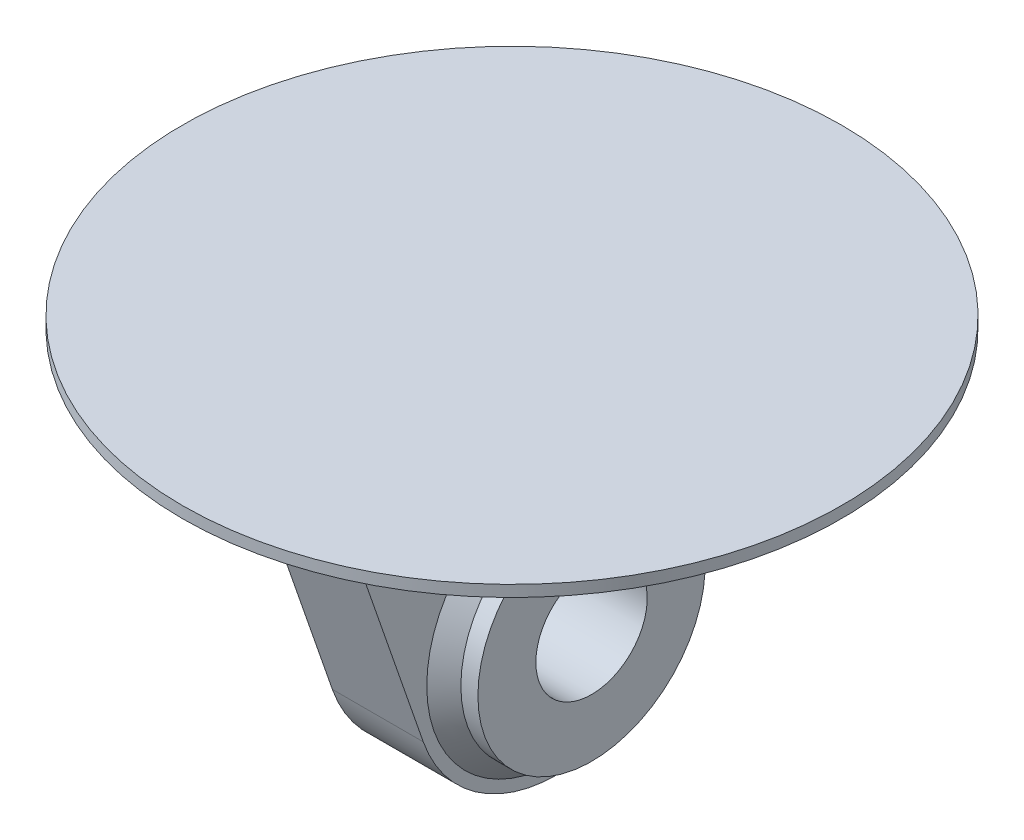
ISO-10303-21;
HEADER;
FILE_DESCRIPTION(('STEP AP214'),'2;1');
FILE_NAME('part.step','',(''),(''),'','','');
FILE_SCHEMA(('AUTOMOTIVE_DESIGN { 1 0 10303 214 1 1 1 1 }'));
ENDSEC;
DATA;
#1=APPLICATION_CONTEXT('core data for automotive mechanical design processes');
#2=APPLICATION_PROTOCOL_DEFINITION('international standard','automotive_design',2000,#1);
#3=PRODUCT_CONTEXT('',#1,'mechanical');
#4=PRODUCT('Part','Part','',(#3));
#5=PRODUCT_RELATED_PRODUCT_CATEGORY('part','',(#4));
#6=PRODUCT_DEFINITION_FORMATION('','',#4);
#7=PRODUCT_DEFINITION_CONTEXT('part definition',#1,'design');
#8=PRODUCT_DEFINITION('design','',#6,#7);
#9=PRODUCT_DEFINITION_SHAPE('','',#8);
#10=(LENGTH_UNIT() NAMED_UNIT(*) SI_UNIT(.MILLI.,.METRE.));
#11=(NAMED_UNIT(*) PLANE_ANGLE_UNIT() SI_UNIT($,.RADIAN.));
#12=(NAMED_UNIT(*) SI_UNIT($,.STERADIAN.) SOLID_ANGLE_UNIT());
#13=UNCERTAINTY_MEASURE_WITH_UNIT(LENGTH_MEASURE(1.E-05),#10,'distance_accuracy_value','');
#14=(GEOMETRIC_REPRESENTATION_CONTEXT(3) GLOBAL_UNCERTAINTY_ASSIGNED_CONTEXT((#13)) GLOBAL_UNIT_ASSIGNED_CONTEXT((#10,
#11,#12)) REPRESENTATION_CONTEXT('',''));
#15=CARTESIAN_POINT('',(0.,0.,0.));
#16=DIRECTION('',(0.,0.,1.));
#17=DIRECTION('',(1.,0.,0.));
#18=AXIS2_PLACEMENT_3D('',#15,#16,#17);
#19=CARTESIAN_POINT('',(0.,0.,0.));
#20=DIRECTION('',(0.,-1.,0.));
#21=DIRECTION('',(0.,0.,-1.));
#22=AXIS2_PLACEMENT_3D('',#19,#20,#21);
#23=PLANE('',#22);
#24=CARTESIAN_POINT('',(0.,0.,0.));
#25=DIRECTION('',(0.,1.,0.));
#26=DIRECTION('',(0.,0.,1.));
#27=AXIS2_PLACEMENT_3D('',#24,#25,#26);
#28=CIRCLE('',#27,368.3);
#29=CARTESIAN_POINT('',(0.,0.,368.3));
#30=VERTEX_POINT('',#29);
#31=EDGE_CURVE('E11',#30,#30,#28,.T.);
#32=ORIENTED_EDGE('',*,*,#31,.T.);
#33=EDGE_LOOP('',(#32));
#34=FACE_BOUND('',#33,.T.);
#35=ADVANCED_FACE('F17',(#34),#23,.F.);
#36=CARTESIAN_POINT('',(1828.8,-260.35,2.80128558521545E-13));
#37=DIRECTION('',(-1.,0.,0.));
#38=DIRECTION('',(0.,0.,1.));
#39=AXIS2_PLACEMENT_3D('',#36,#37,#38);
#40=CYLINDRICAL_SURFACE('',#39,62.23);
#41=CARTESIAN_POINT('',(-88.9,-260.35,0.));
#42=DIRECTION('',(-1.,0.,0.));
#43=DIRECTION('',(0.,0.,1.));
#44=AXIS2_PLACEMENT_3D('',#41,#42,#43);
#45=CIRCLE('',#44,62.23);
#46=CARTESIAN_POINT('',(-88.9,-260.35,62.23));
#47=VERTEX_POINT('',#46);
#48=EDGE_CURVE('E290',#47,#47,#45,.T.);
#49=ORIENTED_EDGE('',*,*,#48,.T.);
#50=EDGE_LOOP('',(#49));
#51=FACE_BOUND('',#50,.T.);
#52=CARTESIAN_POINT('',(88.9,-260.35,0.));
#53=DIRECTION('',(-1.,0.,0.));
#54=DIRECTION('',(0.,0.,1.));
#55=AXIS2_PLACEMENT_3D('',#52,#53,#54);
#56=CIRCLE('',#55,62.23);
#57=CARTESIAN_POINT('',(88.9,-260.35,62.23));
#58=VERTEX_POINT('',#57);
#59=EDGE_CURVE('E284',#58,#58,#56,.T.);
#60=ORIENTED_EDGE('',*,*,#59,.F.);
#61=EDGE_LOOP('',(#60));
#62=FACE_BOUND('',#61,.T.);
#63=ADVANCED_FACE('F460',(#51,#62),#40,.F.);
#64=CARTESIAN_POINT('',(88.9,-260.35,0.));
#65=DIRECTION('',(-1.,0.,0.));
#66=DIRECTION('',(0.,0.,1.));
#67=AXIS2_PLACEMENT_3D('',#64,#65,#66);
#68=PLANE('',#67);
#69=ORIENTED_EDGE('',*,*,#59,.T.);
#70=EDGE_LOOP('',(#69));
#71=FACE_BOUND('',#70,.T.);
#72=CARTESIAN_POINT('',(88.9,-260.35,0.));
#73=DIRECTION('',(-1.,0.,0.));
#74=DIRECTION('',(0.,0.,1.));
#75=AXIS2_PLACEMENT_3D('',#72,#73,#74);
#76=CIRCLE('',#75,127.);
#77=CARTESIAN_POINT('',(88.9,-260.35,127.));
#78=VERTEX_POINT('',#77);
#79=EDGE_CURVE('E280',#78,#78,#76,.T.);
#80=ORIENTED_EDGE('',*,*,#79,.F.);
#81=EDGE_LOOP('',(#80));
#82=FACE_BOUND('',#81,.T.);
#83=ADVANCED_FACE('F467',(#71,#82),#68,.F.);
#84=CARTESIAN_POINT('',(-88.9,-260.35,0.));
#85=DIRECTION('',(-1.,0.,0.));
#86=DIRECTION('',(0.,0.,1.));
#87=AXIS2_PLACEMENT_3D('',#84,#85,#86);
#88=PLANE('',#87);
#89=CARTESIAN_POINT('',(-88.9,-260.35,0.));
#90=DIRECTION('',(-1.,0.,0.));
#91=DIRECTION('',(0.,0.,1.));
#92=AXIS2_PLACEMENT_3D('',#89,#90,#91);
#93=CIRCLE('',#92,127.);
#94=CARTESIAN_POINT('',(-88.9,-260.35,127.));
#95=VERTEX_POINT('',#94);
#96=EDGE_CURVE('E287',#95,#95,#93,.T.);
#97=ORIENTED_EDGE('',*,*,#96,.T.);
#98=EDGE_LOOP('',(#97));
#99=FACE_BOUND('',#98,.T.);
#100=ORIENTED_EDGE('',*,*,#48,.F.);
#101=EDGE_LOOP('',(#100));
#102=FACE_BOUND('',#101,.T.);
#103=ADVANCED_FACE('F503',(#99,#102),#88,.T.);
#104=CARTESIAN_POINT('',(88.9,-260.35,0.));
#105=DIRECTION('',(-1.,0.,0.));
#106=DIRECTION('',(0.,0.,1.));
#107=AXIS2_PLACEMENT_3D('',#104,#105,#106);
#108=CYLINDRICAL_SURFACE('',#107,127.);
#109=CARTESIAN_POINT('',(69.85,-260.35,0.));
#110=DIRECTION('',(-1.,0.,0.));
#111=DIRECTION('',(0.,0.,1.));
#112=AXIS2_PLACEMENT_3D('',#109,#110,#111);
#113=CIRCLE('',#112,127.);
#114=CARTESIAN_POINT('',(69.85,-260.35,127.));
#115=VERTEX_POINT('',#114);
#116=EDGE_CURVE('E231',#115,#115,#113,.F.);
#117=ORIENTED_EDGE('',*,*,#116,.T.);
#118=EDGE_LOOP('',(#117));
#119=FACE_BOUND('',#118,.T.);
#120=ORIENTED_EDGE('',*,*,#79,.T.);
#121=EDGE_LOOP('',(#120));
#122=FACE_BOUND('',#121,.T.);
#123=ADVANCED_FACE('F499',(#119,#122),#108,.T.);
#124=CARTESIAN_POINT('',(-69.85,-260.35,0.));
#125=DIRECTION('',(1.,0.,0.));
#126=DIRECTION('',(0.,0.,-1.));
#127=AXIS2_PLACEMENT_3D('',#124,#125,#126);
#128=CIRCLE('',#127,127.);
#129=CARTESIAN_POINT('',(-69.85,-260.35,-127.));
#130=VERTEX_POINT('',#129);
#131=EDGE_CURVE('E237',#130,#130,#128,.F.);
#132=ORIENTED_EDGE('',*,*,#131,.T.);
#133=EDGE_LOOP('',(#132));
#134=FACE_BOUND('',#133,.T.);
#135=ORIENTED_EDGE('',*,*,#96,.F.);
#136=EDGE_LOOP('',(#135));
#137=FACE_BOUND('',#136,.T.);
#138=ADVANCED_FACE('F502',(#134,#137),#108,.T.);
#139=CARTESIAN_POINT('',(-69.85,-88.9,0.));
#140=DIRECTION('',(0.707106781186549,0.707106781186546,0.));
#141=DIRECTION('',(0.,0.,-1.));
#142=AXIS2_PLACEMENT_3D('',#139,#140,#141);
#143=PLANE('',#142);
#144=DIRECTION('',(-0.707106781186546,0.707106781186549,0.));
#145=VECTOR('',#144,1.);
#146=CARTESIAN_POINT('',(-69.85,-88.9,-101.6));
#147=LINE('',#146,#145);
#148=CARTESIAN_POINT('',(-127.,-31.75,-101.6));
#149=VERTEX_POINT('',#148);
#150=CARTESIAN_POINT('',(-69.85,-88.9,-101.6));
#151=VERTEX_POINT('',#150);
#152=EDGE_CURVE('E204',#149,#151,#147,.F.);
#153=ORIENTED_EDGE('',*,*,#152,.F.);
#154=DIRECTION('',(0.,0.,1.));
#155=VECTOR('',#154,1.);
#156=CARTESIAN_POINT('',(-127.,-31.75,-101.6));
#157=LINE('',#156,#155);
#158=CARTESIAN_POINT('',(-127.,-31.75,-139.7));
#159=VERTEX_POINT('',#158);
#160=EDGE_CURVE('E206',#159,#149,#157,.T.);
#161=ORIENTED_EDGE('',*,*,#160,.F.);
#162=DIRECTION('',(0.707106781186546,-0.707106781186549,0.));
#163=VECTOR('',#162,1.);
#164=CARTESIAN_POINT('',(-69.85,-88.9,-139.7));
#165=LINE('',#164,#163);
#166=CARTESIAN_POINT('',(-69.85,-88.9,-139.7));
#167=VERTEX_POINT('',#166);
#168=EDGE_CURVE('E208',#167,#159,#165,.F.);
#169=ORIENTED_EDGE('',*,*,#168,.F.);
#170=DIRECTION('',(0.,0.,-1.));
#171=VECTOR('',#170,1.);
#172=CARTESIAN_POINT('',(-69.85,-88.9,0.));
#173=LINE('',#172,#171);
#174=EDGE_CURVE('E210',#151,#167,#173,.T.);
#175=ORIENTED_EDGE('',*,*,#174,.F.);
#176=EDGE_LOOP('',(#153,#161,#169,#175));
#177=FACE_BOUND('',#176,.T.);
#178=ADVANCED_FACE('F733',(#177),#143,.F.);
#179=CARTESIAN_POINT('',(69.85,-88.9,0.));
#180=DIRECTION('',(0.707106781186549,-0.707106781186546,0.));
#181=DIRECTION('',(0.,0.,-1.));
#182=AXIS2_PLACEMENT_3D('',#179,#180,#181);
#183=PLANE('',#182);
#184=DIRECTION('',(-0.707106781186546,-0.707106781186549,0.));
#185=VECTOR('',#184,1.);
#186=CARTESIAN_POINT('',(69.85,-88.9,-139.7));
#187=LINE('',#186,#185);
#188=CARTESIAN_POINT('',(127.,-31.75,-139.7));
#189=VERTEX_POINT('',#188);
#190=CARTESIAN_POINT('',(69.85,-88.9,-139.7));
#191=VERTEX_POINT('',#190);
#192=EDGE_CURVE('E213',#189,#191,#187,.T.);
#193=ORIENTED_EDGE('',*,*,#192,.F.);
#194=DIRECTION('',(0.,0.,-1.));
#195=VECTOR('',#194,1.);
#196=CARTESIAN_POINT('',(127.,-31.75,-139.7));
#197=LINE('',#196,#195);
#198=CARTESIAN_POINT('',(127.,-31.75,-101.6));
#199=VERTEX_POINT('',#198);
#200=EDGE_CURVE('E215',#199,#189,#197,.T.);
#201=ORIENTED_EDGE('',*,*,#200,.F.);
#202=DIRECTION('',(0.707106781186546,0.707106781186549,0.));
#203=VECTOR('',#202,1.);
#204=CARTESIAN_POINT('',(69.85,-88.9,-101.6));
#205=LINE('',#204,#203);
#206=CARTESIAN_POINT('',(69.85,-88.9,-101.6));
#207=VERTEX_POINT('',#206);
#208=EDGE_CURVE('E217',#207,#199,#205,.T.);
#209=ORIENTED_EDGE('',*,*,#208,.F.);
#210=DIRECTION('',(0.,0.,1.));
#211=VECTOR('',#210,1.);
#212=CARTESIAN_POINT('',(69.85,-88.9,-101.6));
#213=LINE('',#212,#211);
#214=EDGE_CURVE('E219',#191,#207,#213,.T.);
#215=ORIENTED_EDGE('',*,*,#214,.F.);
#216=EDGE_LOOP('',(#193,#201,#209,#215));
#217=FACE_BOUND('',#216,.T.);
#218=ADVANCED_FACE('F724',(#217),#183,.T.);
#219=CARTESIAN_POINT('',(69.85,-88.9,0.));
#220=DIRECTION('',(0.707106781186549,-0.707106781186546,0.));
#221=DIRECTION('',(0.,0.,-1.));
#222=AXIS2_PLACEMENT_3D('',#219,#220,#221);
#223=PLANE('',#222);
#224=DIRECTION('',(-0.707106781186546,-0.707106781186549,0.));
#225=VECTOR('',#224,1.);
#226=CARTESIAN_POINT('',(69.85,-88.9,101.6));
#227=LINE('',#226,#225);
#228=CARTESIAN_POINT('',(127.,-31.75,101.6));
#229=VERTEX_POINT('',#228);
#230=CARTESIAN_POINT('',(69.85,-88.9,101.6));
#231=VERTEX_POINT('',#230);
#232=EDGE_CURVE('E222',#229,#231,#227,.T.);
#233=ORIENTED_EDGE('',*,*,#232,.F.);
#234=DIRECTION('',(0.,0.,-1.));
#235=VECTOR('',#234,1.);
#236=CARTESIAN_POINT('',(127.,-31.75,101.6));
#237=LINE('',#236,#235);
#238=CARTESIAN_POINT('',(127.,-31.75,139.7));
#239=VERTEX_POINT('',#238);
#240=EDGE_CURVE('E224',#239,#229,#237,.T.);
#241=ORIENTED_EDGE('',*,*,#240,.F.);
#242=DIRECTION('',(0.707106781186546,0.707106781186549,0.));
#243=VECTOR('',#242,1.);
#244=CARTESIAN_POINT('',(69.85,-88.9,139.7));
#245=LINE('',#244,#243);
#246=CARTESIAN_POINT('',(69.85,-88.9,139.7));
#247=VERTEX_POINT('',#246);
#248=EDGE_CURVE('E226',#247,#239,#245,.T.);
#249=ORIENTED_EDGE('',*,*,#248,.F.);
#250=DIRECTION('',(0.,0.,1.));
#251=VECTOR('',#250,1.);
#252=CARTESIAN_POINT('',(69.85,-88.9,139.7));
#253=LINE('',#252,#251);
#254=EDGE_CURVE('E228',#231,#247,#253,.T.);
#255=ORIENTED_EDGE('',*,*,#254,.F.);
#256=EDGE_LOOP('',(#233,#241,#249,#255));
#257=FACE_BOUND('',#256,.T.);
#258=ADVANCED_FACE('F441',(#257),#223,.T.);
#259=CARTESIAN_POINT('',(0.,-88.9,0.));
#260=DIRECTION('',(0.,-1.,0.));
#261=DIRECTION('',(0.,0.,-1.));
#262=AXIS2_PLACEMENT_3D('',#259,#260,#261);
#263=PLANE('',#262);
#264=DIRECTION('',(1.,0.,0.));
#265=VECTOR('',#264,1.);
#266=CARTESIAN_POINT('',(50.8,-88.9,101.6));
#267=LINE('',#266,#265);
#268=CARTESIAN_POINT('',(50.8,-88.9,101.6));
#269=VERTEX_POINT('',#268);
#270=EDGE_CURVE('E315',#269,#231,#267,.T.);
#271=ORIENTED_EDGE('',*,*,#270,.T.);
#272=ORIENTED_EDGE('',*,*,#254,.T.);
#273=DIRECTION('',(-1.,0.,0.));
#274=VECTOR('',#273,1.);
#275=CARTESIAN_POINT('',(50.8,-88.9,139.7));
#276=LINE('',#275,#274);
#277=CARTESIAN_POINT('',(50.8,-88.9,139.7));
#278=VERTEX_POINT('',#277);
#279=EDGE_CURVE('E303',#247,#278,#276,.T.);
#280=ORIENTED_EDGE('',*,*,#279,.T.);
#281=DIRECTION('',(0.,0.,-1.));
#282=VECTOR('',#281,1.);
#283=CARTESIAN_POINT('',(50.8,-88.9,139.7));
#284=LINE('',#283,#282);
#285=EDGE_CURVE('E307',#278,#269,#284,.T.);
#286=ORIENTED_EDGE('',*,*,#285,.T.);
#287=EDGE_LOOP('',(#271,#272,#280,#286));
#288=FACE_BOUND('',#287,.T.);
#289=ADVANCED_FACE('F444',(#288),#263,.T.);
#290=CARTESIAN_POINT('',(0.,-88.9,0.));
#291=DIRECTION('',(0.,-1.,0.));
#292=DIRECTION('',(0.,0.,-1.));
#293=AXIS2_PLACEMENT_3D('',#290,#291,#292);
#294=PLANE('',#293);
#295=DIRECTION('',(1.,0.,0.));
#296=VECTOR('',#295,1.);
#297=CARTESIAN_POINT('',(50.8,-88.9,-139.7));
#298=LINE('',#297,#296);
#299=CARTESIAN_POINT('',(50.8,-88.9,-139.7));
#300=VERTEX_POINT('',#299);
#301=EDGE_CURVE('E323',#300,#191,#298,.T.);
#302=ORIENTED_EDGE('',*,*,#301,.T.);
#303=ORIENTED_EDGE('',*,*,#214,.T.);
#304=DIRECTION('',(-1.,0.,0.));
#305=VECTOR('',#304,1.);
#306=CARTESIAN_POINT('',(50.8,-88.9,-101.6));
#307=LINE('',#306,#305);
#308=CARTESIAN_POINT('',(50.8,-88.9,-101.6));
#309=VERTEX_POINT('',#308);
#310=EDGE_CURVE('E327',#207,#309,#307,.T.);
#311=ORIENTED_EDGE('',*,*,#310,.T.);
#312=DIRECTION('',(0.,0.,-1.));
#313=VECTOR('',#312,1.);
#314=CARTESIAN_POINT('',(50.8,-88.9,-101.6));
#315=LINE('',#314,#313);
#316=EDGE_CURVE('E320',#309,#300,#315,.T.);
#317=ORIENTED_EDGE('',*,*,#316,.T.);
#318=EDGE_LOOP('',(#302,#303,#311,#317));
#319=FACE_BOUND('',#318,.T.);
#320=ADVANCED_FACE('F528',(#319),#294,.T.);
#321=CARTESIAN_POINT('',(50.8,-260.35,0.));
#322=DIRECTION('',(-1.,0.,0.));
#323=DIRECTION('',(0.,0.,1.));
#324=AXIS2_PLACEMENT_3D('',#321,#322,#323);
#325=CONICAL_SURFACE('',#324,146.05,0.785398163397454);
#326=ORIENTED_EDGE('',*,*,#116,.F.);
#327=EDGE_LOOP('',(#326));
#328=FACE_BOUND('',#327,.T.);
#329=CARTESIAN_POINT('',(50.8,-260.35,0.));
#330=DIRECTION('',(-1.,0.,0.));
#331=DIRECTION('',(0.,0.,1.));
#332=AXIS2_PLACEMENT_3D('',#329,#330,#331);
#333=CIRCLE('',#332,146.05);
#334=CARTESIAN_POINT('',(50.8,-260.35,146.05));
#335=VERTEX_POINT('',#334);
#336=EDGE_CURVE('E234',#335,#335,#333,.T.);
#337=ORIENTED_EDGE('',*,*,#336,.F.);
#338=EDGE_LOOP('',(#337));
#339=FACE_BOUND('',#338,.T.);
#340=ADVANCED_FACE('F496',(#328,#339),#325,.T.);
#341=CARTESIAN_POINT('',(1828.8,-260.35,2.80128558521545E-13));
#342=DIRECTION('',(-1.,0.,0.));
#343=DIRECTION('',(0.,0.,1.));
#344=AXIS2_PLACEMENT_3D('',#341,#342,#343);
#345=CYLINDRICAL_SURFACE('',#344,158.75);
#346=DIRECTION('',(-1.,0.,0.));
#347=VECTOR('',#346,1.);
#348=CARTESIAN_POINT('',(1828.8,-312.405318269349,149.972685312616));
#349=LINE('',#348,#347);
#350=CARTESIAN_POINT('',(50.8,-312.405318269349,149.972685312615));
#351=VERTEX_POINT('',#350);
#352=CARTESIAN_POINT('',(-50.8,-312.405318269349,149.972685312615));
#353=VERTEX_POINT('',#352);
#354=EDGE_CURVE('E277',#351,#353,#349,.T.);
#355=ORIENTED_EDGE('',*,*,#354,.T.);
#356=CARTESIAN_POINT('',(-50.8,-260.35,0.));
#357=DIRECTION('',(1.,0.,0.));
#358=DIRECTION('',(0.,0.,1.));
#359=AXIS2_PLACEMENT_3D('',#356,#357,#358);
#360=CIRCLE('',#359,158.75);
#361=CARTESIAN_POINT('',(-50.8,-312.405318269349,-149.972685312615));
#362=VERTEX_POINT('',#361);
#363=EDGE_CURVE('E271',#353,#362,#360,.T.);
#364=ORIENTED_EDGE('',*,*,#363,.T.);
#365=DIRECTION('',(-1.,0.,0.));
#366=VECTOR('',#365,1.);
#367=CARTESIAN_POINT('',(1828.8,-312.405318269349,-149.972685312615));
#368=LINE('',#367,#366);
#369=CARTESIAN_POINT('',(50.8,-312.405318269349,-149.972685312615));
#370=VERTEX_POINT('',#369);
#371=EDGE_CURVE('E278',#370,#362,#368,.T.);
#372=ORIENTED_EDGE('',*,*,#371,.F.);
#373=CARTESIAN_POINT('',(50.8,-260.35,0.));
#374=DIRECTION('',(-1.,0.,0.));
#375=DIRECTION('',(0.,0.,1.));
#376=AXIS2_PLACEMENT_3D('',#373,#374,#375);
#377=CIRCLE('',#376,158.75);
#378=EDGE_CURVE('E259',#351,#370,#377,.F.);
#379=ORIENTED_EDGE('',*,*,#378,.F.);
#380=EDGE_LOOP('',(#355,#364,#372,#379));
#381=FACE_BOUND('',#380,.T.);
#382=ADVANCED_FACE('F413',(#381),#345,.T.);
#383=CARTESIAN_POINT('',(0.,-88.9,0.));
#384=DIRECTION('',(0.,1.,0.));
#385=DIRECTION('',(0.,0.,1.));
#386=AXIS2_PLACEMENT_3D('',#383,#384,#385);
#387=PLANE('',#386);
#388=DIRECTION('',(-1.,0.,0.));
#389=VECTOR('',#388,1.);
#390=CARTESIAN_POINT('',(-50.8,-88.9,-101.6));
#391=LINE('',#390,#389);
#392=CARTESIAN_POINT('',(-50.8,-88.9,-101.6));
#393=VERTEX_POINT('',#392);
#394=EDGE_CURVE('E348',#393,#151,#391,.T.);
#395=ORIENTED_EDGE('',*,*,#394,.T.);
#396=ORIENTED_EDGE('',*,*,#174,.T.);
#397=DIRECTION('',(1.,0.,0.));
#398=VECTOR('',#397,1.);
#399=CARTESIAN_POINT('',(-50.8,-88.9,-139.7));
#400=LINE('',#399,#398);
#401=CARTESIAN_POINT('',(-50.8,-88.9,-139.7));
#402=VERTEX_POINT('',#401);
#403=EDGE_CURVE('E352',#167,#402,#400,.T.);
#404=ORIENTED_EDGE('',*,*,#403,.T.);
#405=DIRECTION('',(0.,0.,1.));
#406=VECTOR('',#405,1.);
#407=CARTESIAN_POINT('',(-50.8,-88.9,-101.6));
#408=LINE('',#407,#406);
#409=EDGE_CURVE('E345',#402,#393,#408,.T.);
#410=ORIENTED_EDGE('',*,*,#409,.T.);
#411=EDGE_LOOP('',(#395,#396,#404,#410));
#412=FACE_BOUND('',#411,.T.);
#413=ADVANCED_FACE('F495',(#412),#387,.F.);
#414=CARTESIAN_POINT('',(-50.8,-260.35,0.));
#415=DIRECTION('',(1.,0.,0.));
#416=DIRECTION('',(0.,0.,-1.));
#417=AXIS2_PLACEMENT_3D('',#414,#415,#416);
#418=CONICAL_SURFACE('',#417,146.05,0.785398163397455);
#419=ORIENTED_EDGE('',*,*,#131,.F.);
#420=EDGE_LOOP('',(#419));
#421=FACE_BOUND('',#420,.T.);
#422=CARTESIAN_POINT('',(-50.8,-260.35,0.));
#423=DIRECTION('',(1.,0.,0.));
#424=DIRECTION('',(0.,0.,-1.));
#425=AXIS2_PLACEMENT_3D('',#422,#423,#424);
#426=CIRCLE('',#425,146.05);
#427=CARTESIAN_POINT('',(-50.8,-260.35,-146.05));
#428=VERTEX_POINT('',#427);
#429=EDGE_CURVE('E240',#428,#428,#426,.T.);
#430=ORIENTED_EDGE('',*,*,#429,.F.);
#431=EDGE_LOOP('',(#430));
#432=FACE_BOUND('',#431,.T.);
#433=ADVANCED_FACE('F483',(#421,#432),#418,.T.);
#434=CARTESIAN_POINT('',(0.,-88.9,0.));
#435=DIRECTION('',(0.,1.,0.));
#436=DIRECTION('',(0.,0.,1.));
#437=AXIS2_PLACEMENT_3D('',#434,#435,#436);
#438=PLANE('',#437);
#439=DIRECTION('',(-1.,0.,0.));
#440=VECTOR('',#439,1.);
#441=CARTESIAN_POINT('',(-50.8,-88.9,139.7));
#442=LINE('',#441,#440);
#443=CARTESIAN_POINT('',(-50.8,-88.9,139.7));
#444=VERTEX_POINT('',#443);
#445=CARTESIAN_POINT('',(-69.85,-88.9,139.7));
#446=VERTEX_POINT('',#445);
#447=EDGE_CURVE('E371',#444,#446,#442,.T.);
#448=ORIENTED_EDGE('',*,*,#447,.T.);
#449=DIRECTION('',(0.,0.,-1.));
#450=VECTOR('',#449,1.);
#451=CARTESIAN_POINT('',(-69.85,-88.9,0.));
#452=LINE('',#451,#450);
#453=CARTESIAN_POINT('',(-69.85,-88.9,101.6));
#454=VERTEX_POINT('',#453);
#455=EDGE_CURVE('E199',#446,#454,#452,.T.);
#456=ORIENTED_EDGE('',*,*,#455,.T.);
#457=DIRECTION('',(1.,0.,0.));
#458=VECTOR('',#457,1.);
#459=CARTESIAN_POINT('',(-50.8,-88.9,101.6));
#460=LINE('',#459,#458);
#461=CARTESIAN_POINT('',(-50.8,-88.9,101.6));
#462=VERTEX_POINT('',#461);
#463=EDGE_CURVE('E374',#454,#462,#460,.T.);
#464=ORIENTED_EDGE('',*,*,#463,.T.);
#465=DIRECTION('',(0.,0.,1.));
#466=VECTOR('',#465,1.);
#467=CARTESIAN_POINT('',(-50.8,-88.9,139.7));
#468=LINE('',#467,#466);
#469=EDGE_CURVE('E368',#462,#444,#468,.T.);
#470=ORIENTED_EDGE('',*,*,#469,.T.);
#471=EDGE_LOOP('',(#448,#456,#464,#470));
#472=FACE_BOUND('',#471,.T.);
#473=ADVANCED_FACE('F384',(#472),#438,.F.);
#474=CARTESIAN_POINT('',(-69.85,-88.9,0.));
#475=DIRECTION('',(0.707106781186549,0.707106781186546,0.));
#476=DIRECTION('',(0.,0.,-1.));
#477=AXIS2_PLACEMENT_3D('',#474,#475,#476);
#478=PLANE('',#477);
#479=DIRECTION('',(-0.707106781186546,0.707106781186549,0.));
#480=VECTOR('',#479,1.);
#481=CARTESIAN_POINT('',(-69.85,-88.9,139.7));
#482=LINE('',#481,#480);
#483=CARTESIAN_POINT('',(-127.,-31.75,139.7));
#484=VERTEX_POINT('',#483);
#485=EDGE_CURVE('E188',#484,#446,#482,.F.);
#486=ORIENTED_EDGE('',*,*,#485,.F.);
#487=DIRECTION('',(0.,0.,1.));
#488=VECTOR('',#487,1.);
#489=CARTESIAN_POINT('',(-127.,-31.75,139.7));
#490=LINE('',#489,#488);
#491=CARTESIAN_POINT('',(-127.,-31.75,101.6));
#492=VERTEX_POINT('',#491);
#493=EDGE_CURVE('E178',#492,#484,#490,.T.);
#494=ORIENTED_EDGE('',*,*,#493,.F.);
#495=DIRECTION('',(0.707106781186546,-0.707106781186549,0.));
#496=VECTOR('',#495,1.);
#497=CARTESIAN_POINT('',(-69.85,-88.9,101.6));
#498=LINE('',#497,#496);
#499=EDGE_CURVE('E187',#454,#492,#498,.F.);
#500=ORIENTED_EDGE('',*,*,#499,.F.);
#501=ORIENTED_EDGE('',*,*,#455,.F.);
#502=EDGE_LOOP('',(#486,#494,#500,#501));
#503=FACE_BOUND('',#502,.T.);
#504=ADVANCED_FACE('F197',(#503),#478,.F.);
#505=CARTESIAN_POINT('',(-50.8,-88.9,101.6));
#506=DIRECTION('',(0.,0.,1.));
#507=DIRECTION('',(1.,0.,0.));
#508=AXIS2_PLACEMENT_3D('',#505,#506,#507);
#509=PLANE('',#508);
#510=ORIENTED_EDGE('',*,*,#463,.F.);
#511=ORIENTED_EDGE('',*,*,#499,.T.);
#512=DIRECTION('',(0.,1.,0.));
#513=VECTOR('',#512,1.);
#514=CARTESIAN_POINT('',(-127.,-88.9,101.6));
#515=LINE('',#514,#513);
#516=CARTESIAN_POINT('',(-127.,-12.7,101.6));
#517=VERTEX_POINT('',#516);
#518=EDGE_CURVE('E184',#492,#517,#515,.T.);
#519=ORIENTED_EDGE('',*,*,#518,.T.);
#520=DIRECTION('',(1.,0.,0.));
#521=VECTOR('',#520,1.);
#522=CARTESIAN_POINT('',(-50.8,-12.7,101.6));
#523=LINE('',#522,#521);
#524=CARTESIAN_POINT('',(-50.8,-12.7,101.6));
#525=VERTEX_POINT('',#524);
#526=EDGE_CURVE('E372',#517,#525,#523,.T.);
#527=ORIENTED_EDGE('',*,*,#526,.T.);
#528=DIRECTION('',(0.,1.,0.));
#529=VECTOR('',#528,1.);
#530=CARTESIAN_POINT('',(-50.8,-88.9,101.6));
#531=LINE('',#530,#529);
#532=EDGE_CURVE('E376',#462,#525,#531,.T.);
#533=ORIENTED_EDGE('',*,*,#532,.F.);
#534=EDGE_LOOP('',(#510,#511,#519,#527,#533));
#535=FACE_BOUND('',#534,.T.);
#536=ADVANCED_FACE('F390',(#535),#509,.F.);
#537=CARTESIAN_POINT('',(-50.8,-88.9,-101.6));
#538=DIRECTION('',(0.,0.,-1.));
#539=DIRECTION('',(-1.,0.,0.));
#540=AXIS2_PLACEMENT_3D('',#537,#538,#539);
#541=PLANE('',#540);
#542=DIRECTION('',(0.,1.,0.));
#543=VECTOR('',#542,1.);
#544=CARTESIAN_POINT('',(-127.,-88.9,-101.6));
#545=LINE('',#544,#543);
#546=CARTESIAN_POINT('',(-127.,-12.7,-101.6));
#547=VERTEX_POINT('',#546);
#548=EDGE_CURVE('E365',#149,#547,#545,.T.);
#549=ORIENTED_EDGE('',*,*,#548,.F.);
#550=ORIENTED_EDGE('',*,*,#152,.T.);
#551=ORIENTED_EDGE('',*,*,#394,.F.);
#552=DIRECTION('',(0.,1.,0.));
#553=VECTOR('',#552,1.);
#554=CARTESIAN_POINT('',(-50.8,-88.9,-101.6));
#555=LINE('',#554,#553);
#556=CARTESIAN_POINT('',(-50.8,-12.7,-101.6));
#557=VERTEX_POINT('',#556);
#558=EDGE_CURVE('E37',#393,#557,#555,.T.);
#559=ORIENTED_EDGE('',*,*,#558,.T.);
#560=DIRECTION('',(-1.,0.,0.));
#561=VECTOR('',#560,1.);
#562=CARTESIAN_POINT('',(-50.8,-12.7,-101.6));
#563=LINE('',#562,#561);
#564=EDGE_CURVE('E344',#557,#547,#563,.T.);
#565=ORIENTED_EDGE('',*,*,#564,.T.);
#566=EDGE_LOOP('',(#549,#550,#551,#559,#565));
#567=FACE_BOUND('',#566,.T.);
#568=ADVANCED_FACE('F542',(#567),#541,.F.);
#569=CARTESIAN_POINT('',(-127.,-88.9,-101.6));
#570=DIRECTION('',(1.,0.,0.));
#571=DIRECTION('',(0.,0.,-1.));
#572=AXIS2_PLACEMENT_3D('',#569,#570,#571);
#573=PLANE('',#572);
#574=DIRECTION('',(0.,1.,0.));
#575=VECTOR('',#574,1.);
#576=CARTESIAN_POINT('',(-127.,-88.9,-139.7));
#577=LINE('',#576,#575);
#578=CARTESIAN_POINT('',(-127.,-12.7,-139.7));
#579=VERTEX_POINT('',#578);
#580=EDGE_CURVE('E363',#159,#579,#577,.T.);
#581=ORIENTED_EDGE('',*,*,#580,.F.);
#582=ORIENTED_EDGE('',*,*,#160,.T.);
#583=ORIENTED_EDGE('',*,*,#548,.T.);
#584=DIRECTION('',(0.,0.,-1.));
#585=VECTOR('',#584,1.);
#586=CARTESIAN_POINT('',(-127.,-12.7,-101.6));
#587=LINE('',#586,#585);
#588=EDGE_CURVE('E357',#547,#579,#587,.T.);
#589=ORIENTED_EDGE('',*,*,#588,.T.);
#590=EDGE_LOOP('',(#581,#582,#583,#589));
#591=FACE_BOUND('',#590,.T.);
#592=ADVANCED_FACE('F538',(#591),#573,.F.);
#593=CARTESIAN_POINT('',(-50.8,-88.9,-139.7));
#594=DIRECTION('',(0.,0.,1.));
#595=DIRECTION('',(1.,0.,0.));
#596=AXIS2_PLACEMENT_3D('',#593,#594,#595);
#597=PLANE('',#596);
#598=ORIENTED_EDGE('',*,*,#403,.F.);
#599=ORIENTED_EDGE('',*,*,#168,.T.);
#600=ORIENTED_EDGE('',*,*,#580,.T.);
#601=DIRECTION('',(1.,0.,0.));
#602=VECTOR('',#601,1.);
#603=CARTESIAN_POINT('',(-50.8,-12.7,-139.7));
#604=LINE('',#603,#602);
#605=CARTESIAN_POINT('',(-50.8,-12.7,-139.7));
#606=VERTEX_POINT('',#605);
#607=EDGE_CURVE('E349',#579,#606,#604,.T.);
#608=ORIENTED_EDGE('',*,*,#607,.T.);
#609=DIRECTION('',(0.,1.,0.));
#610=VECTOR('',#609,1.);
#611=CARTESIAN_POINT('',(-50.8,-88.9,-139.7));
#612=LINE('',#611,#610);
#613=EDGE_CURVE('E354',#402,#606,#612,.T.);
#614=ORIENTED_EDGE('',*,*,#613,.F.);
#615=EDGE_LOOP('',(#598,#599,#600,#608,#614));
#616=FACE_BOUND('',#615,.T.);
#617=ADVANCED_FACE('F492',(#616),#597,.F.);
#618=CARTESIAN_POINT('',(1828.8,-12.7,-254.));
#619=DIRECTION('',(0.,0.327907516657317,0.944709828740884));
#620=DIRECTION('',(0.,-0.944709828740884,0.327907516657317));
#621=AXIS2_PLACEMENT_3D('',#618,#619,#620);
#622=PLANE('',#621);
#623=ORIENTED_EDGE('',*,*,#371,.T.);
#624=DIRECTION('',(0.,0.944709828740884,-0.327907516657317));
#625=VECTOR('',#624,1.);
#626=CARTESIAN_POINT('',(-50.8,-12.7,-254.));
#627=LINE('',#626,#625);
#628=CARTESIAN_POINT('',(-50.8,-12.7,-254.));
#629=VERTEX_POINT('',#628);
#630=EDGE_CURVE('E274',#362,#629,#627,.T.);
#631=ORIENTED_EDGE('',*,*,#630,.T.);
#632=DIRECTION('',(1.,0.,0.));
#633=VECTOR('',#632,1.);
#634=CARTESIAN_POINT('',(-50.8,-12.7,-254.));
#635=LINE('',#634,#633);
#636=CARTESIAN_POINT('',(50.8,-12.7,-254.));
#637=VERTEX_POINT('',#636);
#638=EDGE_CURVE('E246',#629,#637,#635,.T.);
#639=ORIENTED_EDGE('',*,*,#638,.T.);
#640=DIRECTION('',(0.,0.944709828740884,-0.327907516657317));
#641=VECTOR('',#640,1.);
#642=CARTESIAN_POINT('',(50.8,-736.789626013291,-2.66946031481624));
#643=LINE('',#642,#641);
#644=EDGE_CURVE('E265',#370,#637,#643,.T.);
#645=ORIENTED_EDGE('',*,*,#644,.F.);
#646=EDGE_LOOP('',(#623,#631,#639,#645));
#647=FACE_BOUND('',#646,.T.);
#648=ADVANCED_FACE('F403',(#647),#622,.F.);
#649=CARTESIAN_POINT('',(50.8,-88.9,-139.7));
#650=DIRECTION('',(0.,0.,1.));
#651=DIRECTION('',(1.,0.,0.));
#652=AXIS2_PLACEMENT_3D('',#649,#650,#651);
#653=PLANE('',#652);
#654=DIRECTION('',(0.,1.,0.));
#655=VECTOR('',#654,1.);
#656=CARTESIAN_POINT('',(127.,-88.9,-139.7));
#657=LINE('',#656,#655);
#658=CARTESIAN_POINT('',(127.,-12.7,-139.7));
#659=VERTEX_POINT('',#658);
#660=EDGE_CURVE('E340',#189,#659,#657,.T.);
#661=ORIENTED_EDGE('',*,*,#660,.F.);
#662=ORIENTED_EDGE('',*,*,#192,.T.);
#663=ORIENTED_EDGE('',*,*,#301,.F.);
#664=DIRECTION('',(0.,1.,0.));
#665=VECTOR('',#664,1.);
#666=CARTESIAN_POINT('',(50.8,-88.9,-139.7));
#667=LINE('',#666,#665);
#668=CARTESIAN_POINT('',(50.8,-12.7,-139.7));
#669=VERTEX_POINT('',#668);
#670=EDGE_CURVE('E342',#300,#669,#667,.T.);
#671=ORIENTED_EDGE('',*,*,#670,.T.);
#672=DIRECTION('',(1.,0.,0.));
#673=VECTOR('',#672,1.);
#674=CARTESIAN_POINT('',(50.8,-12.7,-139.7));
#675=LINE('',#674,#673);
#676=EDGE_CURVE('E313',#669,#659,#675,.T.);
#677=ORIENTED_EDGE('',*,*,#676,.T.);
#678=EDGE_LOOP('',(#661,#662,#663,#671,#677));
#679=FACE_BOUND('',#678,.T.);
#680=ADVANCED_FACE('F491',(#679),#653,.F.);
#681=CARTESIAN_POINT('',(127.,-88.9,-101.6));
#682=DIRECTION('',(-1.,0.,0.));
#683=DIRECTION('',(0.,0.,1.));
#684=AXIS2_PLACEMENT_3D('',#681,#682,#683);
#685=PLANE('',#684);
#686=DIRECTION('',(0.,1.,0.));
#687=VECTOR('',#686,1.);
#688=CARTESIAN_POINT('',(127.,-88.9,-101.6));
#689=LINE('',#688,#687);
#690=CARTESIAN_POINT('',(127.,-12.7,-101.6));
#691=VERTEX_POINT('',#690);
#692=EDGE_CURVE('E338',#199,#691,#689,.T.);
#693=ORIENTED_EDGE('',*,*,#692,.F.);
#694=ORIENTED_EDGE('',*,*,#200,.T.);
#695=ORIENTED_EDGE('',*,*,#660,.T.);
#696=DIRECTION('',(0.,0.,1.));
#697=VECTOR('',#696,1.);
#698=CARTESIAN_POINT('',(127.,-12.7,-101.6));
#699=LINE('',#698,#697);
#700=EDGE_CURVE('E332',#659,#691,#699,.T.);
#701=ORIENTED_EDGE('',*,*,#700,.T.);
#702=EDGE_LOOP('',(#693,#694,#695,#701));
#703=FACE_BOUND('',#702,.T.);
#704=ADVANCED_FACE('F517',(#703),#685,.F.);
#705=CARTESIAN_POINT('',(50.8,-88.9,-101.6));
#706=DIRECTION('',(0.,0.,-1.));
#707=DIRECTION('',(-1.,0.,0.));
#708=AXIS2_PLACEMENT_3D('',#705,#706,#707);
#709=PLANE('',#708);
#710=ORIENTED_EDGE('',*,*,#310,.F.);
#711=ORIENTED_EDGE('',*,*,#208,.T.);
#712=ORIENTED_EDGE('',*,*,#692,.T.);
#713=DIRECTION('',(-1.,0.,0.));
#714=VECTOR('',#713,1.);
#715=CARTESIAN_POINT('',(50.8,-12.7,-101.6));
#716=LINE('',#715,#714);
#717=CARTESIAN_POINT('',(50.8,-12.7,-101.6));
#718=VERTEX_POINT('',#717);
#719=EDGE_CURVE('E324',#691,#718,#716,.T.);
#720=ORIENTED_EDGE('',*,*,#719,.T.);
#721=DIRECTION('',(0.,1.,0.));
#722=VECTOR('',#721,1.);
#723=CARTESIAN_POINT('',(50.8,-88.9,-101.6));
#724=LINE('',#723,#722);
#725=EDGE_CURVE('E329',#309,#718,#724,.T.);
#726=ORIENTED_EDGE('',*,*,#725,.F.);
#727=EDGE_LOOP('',(#710,#711,#712,#720,#726));
#728=FACE_BOUND('',#727,.T.);
#729=ADVANCED_FACE('F512',(#728),#709,.F.);
#730=CARTESIAN_POINT('',(50.8,-88.9,101.6));
#731=DIRECTION('',(0.,0.,1.));
#732=DIRECTION('',(1.,0.,0.));
#733=AXIS2_PLACEMENT_3D('',#730,#731,#732);
#734=PLANE('',#733);
#735=DIRECTION('',(0.,1.,0.));
#736=VECTOR('',#735,1.);
#737=CARTESIAN_POINT('',(127.,-88.9,101.6));
#738=LINE('',#737,#736);
#739=CARTESIAN_POINT('',(127.,-12.7,101.6));
#740=VERTEX_POINT('',#739);
#741=EDGE_CURVE('E296',#229,#740,#738,.T.);
#742=ORIENTED_EDGE('',*,*,#741,.F.);
#743=ORIENTED_EDGE('',*,*,#232,.T.);
#744=ORIENTED_EDGE('',*,*,#270,.F.);
#745=DIRECTION('',(0.,1.,0.));
#746=VECTOR('',#745,1.);
#747=CARTESIAN_POINT('',(50.8,-88.9,101.6));
#748=LINE('',#747,#746);
#749=CARTESIAN_POINT('',(50.8,-12.7,101.6));
#750=VERTEX_POINT('',#749);
#751=EDGE_CURVE('E293',#269,#750,#748,.T.);
#752=ORIENTED_EDGE('',*,*,#751,.T.);
#753=DIRECTION('',(1.,0.,0.));
#754=VECTOR('',#753,1.);
#755=CARTESIAN_POINT('',(50.8,-12.7,101.6));
#756=LINE('',#755,#754);
#757=EDGE_CURVE('E310',#750,#740,#756,.T.);
#758=ORIENTED_EDGE('',*,*,#757,.T.);
#759=EDGE_LOOP('',(#742,#743,#744,#752,#758));
#760=FACE_BOUND('',#759,.T.);
#761=ADVANCED_FACE('F432',(#760),#734,.F.);
#762=CARTESIAN_POINT('',(127.,-88.9,139.7));
#763=DIRECTION('',(-1.,0.,0.));
#764=DIRECTION('',(0.,0.,1.));
#765=AXIS2_PLACEMENT_3D('',#762,#763,#764);
#766=PLANE('',#765);
#767=DIRECTION('',(0.,1.,0.));
#768=VECTOR('',#767,1.);
#769=CARTESIAN_POINT('',(127.,-88.9,139.7));
#770=LINE('',#769,#768);
#771=CARTESIAN_POINT('',(127.,-12.7,139.7));
#772=VERTEX_POINT('',#771);
#773=EDGE_CURVE('E298',#239,#772,#770,.T.);
#774=ORIENTED_EDGE('',*,*,#773,.F.);
#775=ORIENTED_EDGE('',*,*,#240,.T.);
#776=ORIENTED_EDGE('',*,*,#741,.T.);
#777=DIRECTION('',(0.,0.,1.));
#778=VECTOR('',#777,1.);
#779=CARTESIAN_POINT('',(127.,-12.7,139.7));
#780=LINE('',#779,#778);
#781=EDGE_CURVE('E306',#740,#772,#780,.T.);
#782=ORIENTED_EDGE('',*,*,#781,.T.);
#783=EDGE_LOOP('',(#774,#775,#776,#782));
#784=FACE_BOUND('',#783,.T.);
#785=ADVANCED_FACE('F436',(#784),#766,.F.);
#786=CARTESIAN_POINT('',(50.8,-88.9,139.7));
#787=DIRECTION('',(0.,0.,-1.));
#788=DIRECTION('',(-1.,0.,0.));
#789=AXIS2_PLACEMENT_3D('',#786,#787,#788);
#790=PLANE('',#789);
#791=ORIENTED_EDGE('',*,*,#279,.F.);
#792=ORIENTED_EDGE('',*,*,#248,.T.);
#793=ORIENTED_EDGE('',*,*,#773,.T.);
#794=DIRECTION('',(-1.,0.,0.));
#795=VECTOR('',#794,1.);
#796=CARTESIAN_POINT('',(50.8,-12.7,139.7));
#797=LINE('',#796,#795);
#798=CARTESIAN_POINT('',(50.8,-12.7,139.7));
#799=VERTEX_POINT('',#798);
#800=EDGE_CURVE('E304',#772,#799,#797,.T.);
#801=ORIENTED_EDGE('',*,*,#800,.T.);
#802=DIRECTION('',(0.,1.,0.));
#803=VECTOR('',#802,1.);
#804=CARTESIAN_POINT('',(50.8,-88.9,139.7));
#805=LINE('',#804,#803);
#806=EDGE_CURVE('E300',#278,#799,#805,.T.);
#807=ORIENTED_EDGE('',*,*,#806,.F.);
#808=EDGE_LOOP('',(#791,#792,#793,#801,#807));
#809=FACE_BOUND('',#808,.T.);
#810=ADVANCED_FACE('F446',(#809),#790,.F.);
#811=CARTESIAN_POINT('',(50.8,-647.7,254.));
#812=DIRECTION('',(-1.,0.,0.));
#813=DIRECTION('',(0.,0.,1.));
#814=AXIS2_PLACEMENT_3D('',#811,#812,#813);
#815=PLANE('',#814);
#816=ORIENTED_EDGE('',*,*,#336,.T.);
#817=EDGE_LOOP('',(#816));
#818=FACE_BOUND('',#817,.T.);
#819=ORIENTED_EDGE('',*,*,#670,.F.);
#820=ORIENTED_EDGE('',*,*,#316,.F.);
#821=ORIENTED_EDGE('',*,*,#725,.T.);
#822=DIRECTION('',(0.,0.,1.));
#823=VECTOR('',#822,1.);
#824=CARTESIAN_POINT('',(50.8,-12.7,254.));
#825=LINE('',#824,#823);
#826=EDGE_CURVE('E257',#718,#750,#825,.T.);
#827=ORIENTED_EDGE('',*,*,#826,.T.);
#828=ORIENTED_EDGE('',*,*,#751,.F.);
#829=ORIENTED_EDGE('',*,*,#285,.F.);
#830=ORIENTED_EDGE('',*,*,#806,.T.);
#831=CARTESIAN_POINT('',(50.8,-12.7,254.));
#832=VERTEX_POINT('',#831);
#833=EDGE_CURVE('E258',#799,#832,#825,.T.);
#834=ORIENTED_EDGE('',*,*,#833,.T.);
#835=DIRECTION('',(0.,-0.944709828740884,-0.327907516657317));
#836=VECTOR('',#835,1.);
#837=CARTESIAN_POINT('',(50.8,-579.422679429966,57.2913167708438));
#838=LINE('',#837,#836);
#839=EDGE_CURVE('E262',#832,#351,#838,.T.);
#840=ORIENTED_EDGE('',*,*,#839,.T.);
#841=ORIENTED_EDGE('',*,*,#378,.T.);
#842=ORIENTED_EDGE('',*,*,#644,.T.);
#843=EDGE_CURVE('E254',#637,#669,#825,.T.);
#844=ORIENTED_EDGE('',*,*,#843,.T.);
#845=EDGE_LOOP('',(#819,#820,#821,#827,#828,#829,#830,#834,#840,#841,#842,#844));
#846=FACE_BOUND('',#845,.T.);
#847=ADVANCED_FACE('F410',(#818,#846),#815,.F.);
#848=CARTESIAN_POINT('',(1828.8,-12.7,254.));
#849=DIRECTION('',(0.,0.327907516657317,-0.944709828740884));
#850=DIRECTION('',(0.,0.944709828740884,0.327907516657317));
#851=AXIS2_PLACEMENT_3D('',#848,#849,#850);
#852=PLANE('',#851);
#853=DIRECTION('',(-1.,0.,0.));
#854=VECTOR('',#853,1.);
#855=CARTESIAN_POINT('',(-50.8,-12.7,254.));
#856=LINE('',#855,#854);
#857=CARTESIAN_POINT('',(-50.8,-12.7,254.));
#858=VERTEX_POINT('',#857);
#859=EDGE_CURVE('E252',#832,#858,#856,.T.);
#860=ORIENTED_EDGE('',*,*,#859,.T.);
#861=DIRECTION('',(0.,-0.944709828740884,-0.327907516657317));
#862=VECTOR('',#861,1.);
#863=CARTESIAN_POINT('',(-50.8,-12.7,254.));
#864=LINE('',#863,#862);
#865=EDGE_CURVE('E268',#858,#353,#864,.T.);
#866=ORIENTED_EDGE('',*,*,#865,.T.);
#867=ORIENTED_EDGE('',*,*,#354,.F.);
#868=ORIENTED_EDGE('',*,*,#839,.F.);
#869=EDGE_LOOP('',(#860,#866,#867,#868));
#870=FACE_BOUND('',#869,.T.);
#871=ADVANCED_FACE('F422',(#870),#852,.F.);
#872=CARTESIAN_POINT('',(-50.8,-647.7,254.));
#873=DIRECTION('',(1.,0.,0.));
#874=DIRECTION('',(0.,0.,-1.));
#875=AXIS2_PLACEMENT_3D('',#872,#873,#874);
#876=PLANE('',#875);
#877=ORIENTED_EDGE('',*,*,#429,.T.);
#878=EDGE_LOOP('',(#877));
#879=FACE_BOUND('',#878,.T.);
#880=DIRECTION('',(0.,1.,0.));
#881=VECTOR('',#880,1.);
#882=CARTESIAN_POINT('',(-50.8,-88.9,139.7));
#883=LINE('',#882,#881);
#884=CARTESIAN_POINT('',(-50.8,-12.7,139.7));
#885=VERTEX_POINT('',#884);
#886=EDGE_CURVE('E24',#444,#885,#883,.T.);
#887=ORIENTED_EDGE('',*,*,#886,.F.);
#888=ORIENTED_EDGE('',*,*,#469,.F.);
#889=ORIENTED_EDGE('',*,*,#532,.T.);
#890=DIRECTION('',(0.,0.,-1.));
#891=VECTOR('',#890,1.);
#892=CARTESIAN_POINT('',(-50.8,-12.7,254.));
#893=LINE('',#892,#891);
#894=EDGE_CURVE('E250',#525,#557,#893,.T.);
#895=ORIENTED_EDGE('',*,*,#894,.T.);
#896=ORIENTED_EDGE('',*,*,#558,.F.);
#897=ORIENTED_EDGE('',*,*,#409,.F.);
#898=ORIENTED_EDGE('',*,*,#613,.T.);
#899=EDGE_CURVE('E251',#606,#629,#893,.T.);
#900=ORIENTED_EDGE('',*,*,#899,.T.);
#901=ORIENTED_EDGE('',*,*,#630,.F.);
#902=ORIENTED_EDGE('',*,*,#363,.F.);
#903=ORIENTED_EDGE('',*,*,#865,.F.);
#904=EDGE_CURVE('E248',#858,#885,#893,.T.);
#905=ORIENTED_EDGE('',*,*,#904,.T.);
#906=EDGE_LOOP('',(#887,#888,#889,#895,#896,#897,#898,#900,#901,#902,#903,#905));
#907=FACE_BOUND('',#906,.T.);
#908=ADVANCED_FACE('F387',(#879,#907),#876,.F.);
#909=CARTESIAN_POINT('',(-50.8,-88.9,139.7));
#910=DIRECTION('',(0.,0.,-1.));
#911=DIRECTION('',(-1.,0.,0.));
#912=AXIS2_PLACEMENT_3D('',#909,#910,#911);
#913=PLANE('',#912);
#914=DIRECTION('',(0.,1.,0.));
#915=VECTOR('',#914,1.);
#916=CARTESIAN_POINT('',(-127.,-88.9,139.7));
#917=LINE('',#916,#915);
#918=CARTESIAN_POINT('',(-127.,-12.7,139.7));
#919=VERTEX_POINT('',#918);
#920=EDGE_CURVE('E182',#484,#919,#917,.T.);
#921=ORIENTED_EDGE('',*,*,#920,.F.);
#922=ORIENTED_EDGE('',*,*,#485,.T.);
#923=ORIENTED_EDGE('',*,*,#447,.F.);
#924=ORIENTED_EDGE('',*,*,#886,.T.);
#925=DIRECTION('',(-1.,0.,0.));
#926=VECTOR('',#925,1.);
#927=CARTESIAN_POINT('',(-50.8,-12.7,139.7));
#928=LINE('',#927,#926);
#929=EDGE_CURVE('E194',#885,#919,#928,.T.);
#930=ORIENTED_EDGE('',*,*,#929,.T.);
#931=EDGE_LOOP('',(#921,#922,#923,#924,#930));
#932=FACE_BOUND('',#931,.T.);
#933=ADVANCED_FACE('F192',(#932),#913,.F.);
#934=CARTESIAN_POINT('',(-127.,-88.9,139.7));
#935=DIRECTION('',(1.,0.,0.));
#936=DIRECTION('',(0.,0.,-1.));
#937=AXIS2_PLACEMENT_3D('',#934,#935,#936);
#938=PLANE('',#937);
#939=ORIENTED_EDGE('',*,*,#518,.F.);
#940=ORIENTED_EDGE('',*,*,#493,.T.);
#941=ORIENTED_EDGE('',*,*,#920,.T.);
#942=DIRECTION('',(0.,0.,-1.));
#943=VECTOR('',#942,1.);
#944=CARTESIAN_POINT('',(-127.,-12.7,139.7));
#945=LINE('',#944,#943);
#946=EDGE_CURVE('E378',#919,#517,#945,.T.);
#947=ORIENTED_EDGE('',*,*,#946,.T.);
#948=EDGE_LOOP('',(#939,#940,#941,#947));
#949=FACE_BOUND('',#948,.T.);
#950=ADVANCED_FACE('F180',(#949),#938,.F.);
#951=CARTESIAN_POINT('',(0.,-12.7,0.));
#952=DIRECTION('',(0.,-1.,0.));
#953=DIRECTION('',(0.,0.,-1.));
#954=AXIS2_PLACEMENT_3D('',#951,#952,#953);
#955=PLANE('',#954);
#956=CARTESIAN_POINT('',(0.,-12.7,0.));
#957=DIRECTION('',(0.,-1.,0.));
#958=DIRECTION('',(0.,0.,-1.));
#959=AXIS2_PLACEMENT_3D('',#956,#957,#958);
#960=CIRCLE('',#959,368.3);
#961=CARTESIAN_POINT('',(0.,-12.7,-368.3));
#962=VERTEX_POINT('',#961);
#963=EDGE_CURVE('E243',#962,#962,#960,.T.);
#964=ORIENTED_EDGE('',*,*,#963,.T.);
#965=EDGE_LOOP('',(#964));
#966=FACE_BOUND('',#965,.T.);
#967=ORIENTED_EDGE('',*,*,#946,.F.);
#968=ORIENTED_EDGE('',*,*,#929,.F.);
#969=ORIENTED_EDGE('',*,*,#904,.F.);
#970=ORIENTED_EDGE('',*,*,#859,.F.);
#971=ORIENTED_EDGE('',*,*,#833,.F.);
#972=ORIENTED_EDGE('',*,*,#800,.F.);
#973=ORIENTED_EDGE('',*,*,#781,.F.);
#974=ORIENTED_EDGE('',*,*,#757,.F.);
#975=ORIENTED_EDGE('',*,*,#826,.F.);
#976=ORIENTED_EDGE('',*,*,#719,.F.);
#977=ORIENTED_EDGE('',*,*,#700,.F.);
#978=ORIENTED_EDGE('',*,*,#676,.F.);
#979=ORIENTED_EDGE('',*,*,#843,.F.);
#980=ORIENTED_EDGE('',*,*,#638,.F.);
#981=ORIENTED_EDGE('',*,*,#899,.F.);
#982=ORIENTED_EDGE('',*,*,#607,.F.);
#983=ORIENTED_EDGE('',*,*,#588,.F.);
#984=ORIENTED_EDGE('',*,*,#564,.F.);
#985=ORIENTED_EDGE('',*,*,#894,.F.);
#986=ORIENTED_EDGE('',*,*,#526,.F.);
#987=EDGE_LOOP('',(#967,#968,#969,#970,#971,#972,#973,#974,#975,#976,#977,#978,#979,#980,#981,
#982,#983,#984,#985,#986));
#988=FACE_BOUND('',#987,.T.);
#989=ADVANCED_FACE('F393',(#966,#988),#955,.T.);
#990=CARTESIAN_POINT('',(0.,-12.7,0.));
#991=DIRECTION('',(0.,1.,0.));
#992=DIRECTION('',(0.,0.,1.));
#993=AXIS2_PLACEMENT_3D('',#990,#991,#992);
#994=CYLINDRICAL_SURFACE('',#993,368.3);
#995=ORIENTED_EDGE('',*,*,#963,.F.);
#996=EDGE_LOOP('',(#995));
#997=FACE_BOUND('',#996,.T.);
#998=ORIENTED_EDGE('',*,*,#31,.F.);
#999=EDGE_LOOP('',(#998));
#1000=FACE_BOUND('',#999,.T.);
#1001=ADVANCED_FACE('F462',(#997,#1000),#994,.T.);
#1002=CLOSED_SHELL('',(#35,#63,#83,#103,#123,#138,#178,#218,#258,#289,#320,#340,#382,#413,#433,
#473,#504,#536,#568,#592,#617,#648,#680,#704,#729,#761,#785,#810,#847,#871,#908,#933,#950,#989,#1001));
#1003=MANIFOLD_SOLID_BREP('B1',#1002);
#1004=ADVANCED_BREP_SHAPE_REPRESENTATION('',(#18,#1003),#14);
#1005=SHAPE_DEFINITION_REPRESENTATION(#9,#1004);
ENDSEC;
END-ISO-10303-21;
